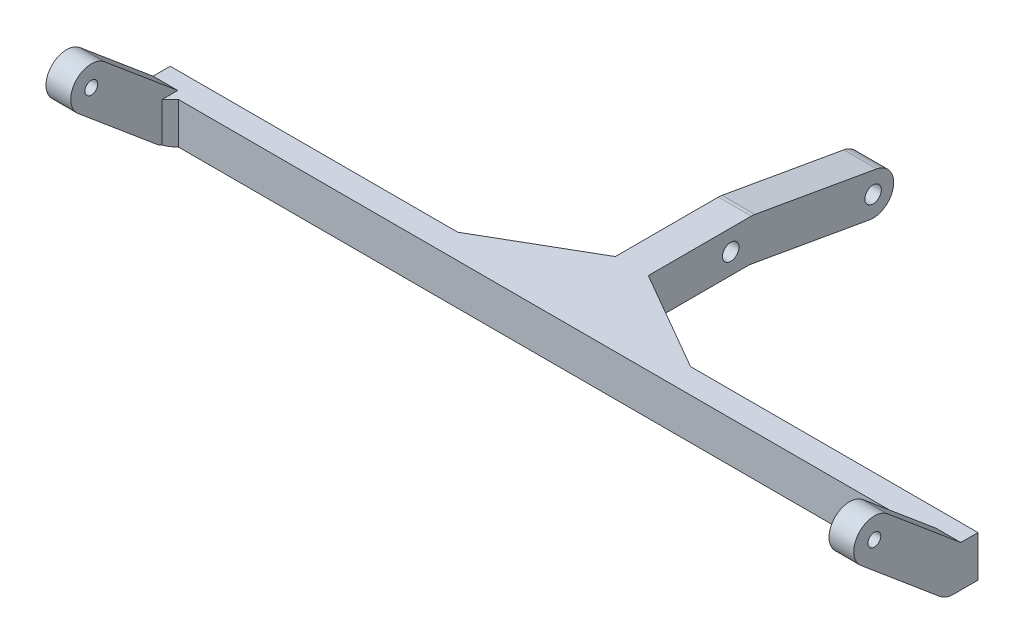
ISO-10303-21;
HEADER;
FILE_DESCRIPTION(('STEP AP214'),'2;1');
FILE_NAME('part.step','',(''),(''),'','','');
FILE_SCHEMA(('AUTOMOTIVE_DESIGN { 1 0 10303 214 1 1 1 1 }'));
ENDSEC;
DATA;
#1=APPLICATION_CONTEXT('core data for automotive mechanical design processes');
#2=APPLICATION_PROTOCOL_DEFINITION('international standard','automotive_design',2000,#1);
#3=PRODUCT_CONTEXT('',#1,'mechanical');
#4=PRODUCT('Part','Part','',(#3));
#5=PRODUCT_RELATED_PRODUCT_CATEGORY('part','',(#4));
#6=PRODUCT_DEFINITION_FORMATION('','',#4);
#7=PRODUCT_DEFINITION_CONTEXT('part definition',#1,'design');
#8=PRODUCT_DEFINITION('design','',#6,#7);
#9=PRODUCT_DEFINITION_SHAPE('','',#8);
#10=(LENGTH_UNIT() NAMED_UNIT(*) SI_UNIT(.MILLI.,.METRE.));
#11=(NAMED_UNIT(*) PLANE_ANGLE_UNIT() SI_UNIT($,.RADIAN.));
#12=(NAMED_UNIT(*) SI_UNIT($,.STERADIAN.) SOLID_ANGLE_UNIT());
#13=UNCERTAINTY_MEASURE_WITH_UNIT(LENGTH_MEASURE(1.E-05),#10,'distance_accuracy_value','');
#14=(GEOMETRIC_REPRESENTATION_CONTEXT(3) GLOBAL_UNCERTAINTY_ASSIGNED_CONTEXT((#13)) GLOBAL_UNIT_ASSIGNED_CONTEXT((#10,
#11,#12)) REPRESENTATION_CONTEXT('',''));
#15=CARTESIAN_POINT('',(0.,0.,0.));
#16=DIRECTION('',(0.,0.,1.));
#17=DIRECTION('',(1.,0.,0.));
#18=AXIS2_PLACEMENT_3D('',#15,#16,#17);
#19=CARTESIAN_POINT('',(0.,-5.,0.));
#20=DIRECTION('',(0.,-1.,0.));
#21=DIRECTION('',(0.,0.,-1.));
#22=AXIS2_PLACEMENT_3D('',#19,#20,#21);
#23=PLANE('',#22);
#24=DIRECTION('',(0.,0.,1.));
#25=VECTOR('',#24,1.);
#26=CARTESIAN_POINT('',(-98.,-5.,0.));
#27=LINE('',#26,#25);
#28=CARTESIAN_POINT('',(-98.,-5.,-5.99999999999996));
#29=VERTEX_POINT('',#28);
#30=CARTESIAN_POINT('',(-98.,-5.,0.));
#31=VERTEX_POINT('',#30);
#32=EDGE_CURVE('E279',#29,#31,#27,.T.);
#33=ORIENTED_EDGE('',*,*,#32,.F.);
#34=DIRECTION('',(1.,0.,0.));
#35=VECTOR('',#34,1.);
#36=CARTESIAN_POINT('',(-24.7846096908263,-5.,-5.99999999999995));
#37=LINE('',#36,#35);
#38=CARTESIAN_POINT('',(-28.248711305964,-5.,-5.99999999999995));
#39=VERTEX_POINT('',#38);
#40=EDGE_CURVE('E210',#29,#39,#37,.T.);
#41=ORIENTED_EDGE('',*,*,#40,.T.);
#42=DIRECTION('',(-0.866025403784436,0.,0.500000000000004));
#43=VECTOR('',#42,1.);
#44=CARTESIAN_POINT('',(-24.7846096908263,-5.,-7.99999999999998));
#45=LINE('',#44,#43);
#46=CARTESIAN_POINT('',(-3.99999999999998,-5.,-20.));
#47=VERTEX_POINT('',#46);
#48=EDGE_CURVE('E296',#47,#39,#45,.T.);
#49=ORIENTED_EDGE('',*,*,#48,.F.);
#50=DIRECTION('',(0.,0.,1.));
#51=VECTOR('',#50,1.);
#52=CARTESIAN_POINT('',(-3.99999999999998,-5.,-20.));
#53=LINE('',#52,#51);
#54=CARTESIAN_POINT('',(-4.,-5.,-44.5625566823704));
#55=VERTEX_POINT('',#54);
#56=EDGE_CURVE('E293',#55,#47,#53,.T.);
#57=ORIENTED_EDGE('',*,*,#56,.F.);
#58=DIRECTION('',(1.,0.,0.));
#59=VECTOR('',#58,1.);
#60=CARTESIAN_POINT('',(0.,-5.,-44.5625566823704));
#61=LINE('',#60,#59);
#62=CARTESIAN_POINT('',(4.,-5.,-44.5625566823704));
#63=VERTEX_POINT('',#62);
#64=EDGE_CURVE('E184',#55,#63,#61,.T.);
#65=ORIENTED_EDGE('',*,*,#64,.T.);
#66=DIRECTION('',(0.,0.,-1.));
#67=VECTOR('',#66,1.);
#68=CARTESIAN_POINT('',(4.,-5.,-20.));
#69=LINE('',#68,#67);
#70=CARTESIAN_POINT('',(4.,-5.,-20.));
#71=VERTEX_POINT('',#70);
#72=EDGE_CURVE('E290',#71,#63,#69,.T.);
#73=ORIENTED_EDGE('',*,*,#72,.F.);
#74=DIRECTION('',(-0.866025403784436,0.,-0.500000000000004));
#75=VECTOR('',#74,1.);
#76=CARTESIAN_POINT('',(24.7846096908263,-5.,-7.99999999999998));
#77=LINE('',#76,#75);
#78=CARTESIAN_POINT('',(28.248711305964,-5.,-5.99999999999998));
#79=VERTEX_POINT('',#78);
#80=EDGE_CURVE('E288',#79,#71,#77,.T.);
#81=ORIENTED_EDGE('',*,*,#80,.F.);
#82=DIRECTION('',(1.,0.,0.));
#83=VECTOR('',#82,1.);
#84=CARTESIAN_POINT('',(98.,-5.,-6.00000000000001));
#85=LINE('',#84,#83);
#86=CARTESIAN_POINT('',(98.,-5.,-5.99999999999999));
#87=VERTEX_POINT('',#86);
#88=EDGE_CURVE('E148',#79,#87,#85,.T.);
#89=ORIENTED_EDGE('',*,*,#88,.T.);
#90=DIRECTION('',(0.,0.,-1.));
#91=VECTOR('',#90,1.);
#92=CARTESIAN_POINT('',(98.,-5.,0.));
#93=LINE('',#92,#91);
#94=CARTESIAN_POINT('',(98.,-5.,0.));
#95=VERTEX_POINT('',#94);
#96=EDGE_CURVE('E284',#95,#87,#93,.T.);
#97=ORIENTED_EDGE('',*,*,#96,.F.);
#98=DIRECTION('',(1.,0.,0.));
#99=VECTOR('',#98,1.);
#100=CARTESIAN_POINT('',(98.,-5.,0.));
#101=LINE('',#100,#99);
#102=CARTESIAN_POINT('',(90.,-5.,0.));
#103=VERTEX_POINT('',#102);
#104=EDGE_CURVE('E55',#103,#95,#101,.T.);
#105=ORIENTED_EDGE('',*,*,#104,.F.);
#106=CARTESIAN_POINT('',(-90.,-5.,0.));
#107=VERTEX_POINT('',#106);
#108=EDGE_CURVE('E285',#107,#103,#101,.T.);
#109=ORIENTED_EDGE('',*,*,#108,.F.);
#110=EDGE_CURVE('E77',#31,#107,#101,.T.);
#111=ORIENTED_EDGE('',*,*,#110,.F.);
#112=EDGE_LOOP('',(#33,#41,#49,#57,#65,#73,#81,#89,#97,#105,#109,#111));
#113=FACE_BOUND('',#112,.T.);
#114=ADVANCED_FACE('F37',(#113),#23,.T.);
#115=CARTESIAN_POINT('',(-98.,5.,0.));
#116=DIRECTION('',(1.,0.,0.));
#117=DIRECTION('',(0.,0.,-1.));
#118=AXIS2_PLACEMENT_3D('',#115,#116,#117);
#119=PLANE('',#118);
#120=DIRECTION('',(0.,0.,1.));
#121=VECTOR('',#120,1.);
#122=CARTESIAN_POINT('',(-98.,5.,0.));
#123=LINE('',#122,#121);
#124=CARTESIAN_POINT('',(-98.,5.,-5.99999999999996));
#125=VERTEX_POINT('',#124);
#126=CARTESIAN_POINT('',(-98.,5.,-1.819851171331));
#127=VERTEX_POINT('',#126);
#128=EDGE_CURVE('E268',#125,#127,#123,.T.);
#129=ORIENTED_EDGE('',*,*,#128,.F.);
#130=DIRECTION('',(0.,-1.,0.));
#131=VECTOR('',#130,1.);
#132=CARTESIAN_POINT('',(-98.,5.,-5.99999999999996));
#133=LINE('',#132,#131);
#134=EDGE_CURVE('E213',#125,#29,#133,.T.);
#135=ORIENTED_EDGE('',*,*,#134,.T.);
#136=ORIENTED_EDGE('',*,*,#32,.T.);
#137=CARTESIAN_POINT('',(-98.,0.,0.));
#138=DIRECTION('',(1.,0.,0.));
#139=DIRECTION('',(0.,0.,-1.));
#140=AXIS2_PLACEMENT_3D('',#137,#138,#139);
#141=CIRCLE('',#140,5.);
#142=CARTESIAN_POINT('',(-98.,-3.83022221559491,3.21393804843268));
#143=VERTEX_POINT('',#142);
#144=EDGE_CURVE('E403',#143,#31,#141,.T.);
#145=ORIENTED_EDGE('',*,*,#144,.F.);
#146=DIRECTION('',(0.,-0.642787609686535,-0.766044443118982));
#147=VECTOR('',#146,1.);
#148=CARTESIAN_POINT('',(-98.,-1.76434265976225,5.6759574309632));
#149=LINE('',#148,#147);
#150=CARTESIAN_POINT('',(-98.,12.2394680265685,22.3650491264072));
#151=VERTEX_POINT('',#150);
#152=EDGE_CURVE('E405',#151,#143,#149,.T.);
#153=ORIENTED_EDGE('',*,*,#152,.F.);
#154=CARTESIAN_POINT('',(-98.,16.0696902421634,19.1511110779745));
#155=DIRECTION('',(1.,0.,0.));
#156=DIRECTION('',(0.,0.,-1.));
#157=AXIS2_PLACEMENT_3D('',#154,#155,#156);
#158=CIRCLE('',#157,5.);
#159=CARTESIAN_POINT('',(-98.,19.8999124577583,15.9371730295419));
#160=VERTEX_POINT('',#159);
#161=EDGE_CURVE('E398',#160,#151,#158,.T.);
#162=ORIENTED_EDGE('',*,*,#161,.F.);
#163=DIRECTION('',(0.,0.642787609686535,0.766044443118982));
#164=VECTOR('',#163,1.);
#165=CARTESIAN_POINT('',(-98.,5.89610177142756,-0.751918665902149));
#166=LINE('',#165,#164);
#167=EDGE_CURVE('E344',#127,#160,#166,.T.);
#168=ORIENTED_EDGE('',*,*,#167,.F.);
#169=EDGE_LOOP('',(#129,#135,#136,#145,#153,#162,#168));
#170=FACE_BOUND('',#169,.T.);
#171=CARTESIAN_POINT('',(-98.,16.0696902421634,19.1511110779745));
#172=DIRECTION('',(1.,0.,0.));
#173=DIRECTION('',(0.,0.,-1.));
#174=AXIS2_PLACEMENT_3D('',#171,#172,#173);
#175=CIRCLE('',#174,1.56363376584898);
#176=CARTESIAN_POINT('',(-98.,16.0696902421634,17.5874773121256));
#177=VERTEX_POINT('',#176);
#178=EDGE_CURVE('E419',#177,#177,#175,.T.);
#179=ORIENTED_EDGE('',*,*,#178,.T.);
#180=EDGE_LOOP('',(#179));
#181=FACE_BOUND('',#180,.T.);
#182=ADVANCED_FACE('F335',(#170,#181),#119,.F.);
#183=CARTESIAN_POINT('',(98.,5.,0.));
#184=DIRECTION('',(0.,0.,-1.));
#185=DIRECTION('',(-1.,0.,0.));
#186=AXIS2_PLACEMENT_3D('',#183,#184,#185);
#187=PLANE('',#186);
#188=DIRECTION('',(1.,0.,0.));
#189=VECTOR('',#188,1.);
#190=CARTESIAN_POINT('',(98.,5.,0.));
#191=LINE('',#190,#189);
#192=CARTESIAN_POINT('',(-90.,5.,0.));
#193=VERTEX_POINT('',#192);
#194=CARTESIAN_POINT('',(90.,5.,0.));
#195=VERTEX_POINT('',#194);
#196=EDGE_CURVE('E263',#193,#195,#191,.T.);
#197=ORIENTED_EDGE('',*,*,#196,.F.);
#198=DIRECTION('',(0.,-1.,0.));
#199=VECTOR('',#198,1.);
#200=CARTESIAN_POINT('',(-90.,5.,0.));
#201=LINE('',#200,#199);
#202=EDGE_CURVE('E194',#193,#107,#201,.T.);
#203=ORIENTED_EDGE('',*,*,#202,.T.);
#204=ORIENTED_EDGE('',*,*,#108,.T.);
#205=DIRECTION('',(0.,1.,0.));
#206=VECTOR('',#205,1.);
#207=CARTESIAN_POINT('',(90.,5.,0.));
#208=LINE('',#207,#206);
#209=EDGE_CURVE('E187',#103,#195,#208,.T.);
#210=ORIENTED_EDGE('',*,*,#209,.T.);
#211=EDGE_LOOP('',(#197,#203,#204,#210));
#212=FACE_BOUND('',#211,.T.);
#213=ADVANCED_FACE('F485',(#212),#187,.F.);
#214=CARTESIAN_POINT('',(98.,5.,0.));
#215=DIRECTION('',(-1.,0.,0.));
#216=DIRECTION('',(0.,0.,1.));
#217=AXIS2_PLACEMENT_3D('',#214,#215,#216);
#218=PLANE('',#217);
#219=ORIENTED_EDGE('',*,*,#96,.T.);
#220=DIRECTION('',(0.,1.,0.));
#221=VECTOR('',#220,1.);
#222=CARTESIAN_POINT('',(98.,5.,-5.99999999999999));
#223=LINE('',#222,#221);
#224=CARTESIAN_POINT('',(98.,5.,-6.00000000000001));
#225=VERTEX_POINT('',#224);
#226=EDGE_CURVE('E158',#87,#225,#223,.T.);
#227=ORIENTED_EDGE('',*,*,#226,.T.);
#228=DIRECTION('',(0.,0.,-1.));
#229=VECTOR('',#228,1.);
#230=CARTESIAN_POINT('',(98.,5.,0.));
#231=LINE('',#230,#229);
#232=CARTESIAN_POINT('',(98.,5.,-1.819851171331));
#233=VERTEX_POINT('',#232);
#234=EDGE_CURVE('E256',#233,#225,#231,.T.);
#235=ORIENTED_EDGE('',*,*,#234,.F.);
#236=DIRECTION('',(0.,0.642787609686535,0.766044443118982));
#237=VECTOR('',#236,1.);
#238=CARTESIAN_POINT('',(98.,5.89610177142756,-0.751918665902149));
#239=LINE('',#238,#237);
#240=CARTESIAN_POINT('',(97.9999999999999,19.8999124577583,15.9371730295419));
#241=VERTEX_POINT('',#240);
#242=EDGE_CURVE('E365',#233,#241,#239,.T.);
#243=ORIENTED_EDGE('',*,*,#242,.T.);
#244=CARTESIAN_POINT('',(97.9999999999999,16.0696902421634,19.1511110779745));
#245=DIRECTION('',(-1.,0.,0.));
#246=DIRECTION('',(0.,0.,1.));
#247=AXIS2_PLACEMENT_3D('',#244,#245,#246);
#248=CIRCLE('',#247,5.);
#249=CARTESIAN_POINT('',(97.9999999999999,12.2394680265685,22.3650491264072));
#250=VERTEX_POINT('',#249);
#251=EDGE_CURVE('E367',#250,#241,#248,.T.);
#252=ORIENTED_EDGE('',*,*,#251,.F.);
#253=DIRECTION('',(0.,-0.642787609686535,-0.766044443118982));
#254=VECTOR('',#253,1.);
#255=CARTESIAN_POINT('',(98.,-1.76434265976225,5.6759574309632));
#256=LINE('',#255,#254);
#257=CARTESIAN_POINT('',(98.,-3.83022221559491,3.21393804843267));
#258=VERTEX_POINT('',#257);
#259=EDGE_CURVE('E358',#250,#258,#256,.T.);
#260=ORIENTED_EDGE('',*,*,#259,.T.);
#261=CARTESIAN_POINT('',(98.,0.,0.));
#262=DIRECTION('',(-1.,0.,0.));
#263=DIRECTION('',(0.,0.,1.));
#264=AXIS2_PLACEMENT_3D('',#261,#262,#263);
#265=CIRCLE('',#264,5.);
#266=EDGE_CURVE('E362',#95,#258,#265,.T.);
#267=ORIENTED_EDGE('',*,*,#266,.F.);
#268=EDGE_LOOP('',(#219,#227,#235,#243,#252,#260,#267));
#269=FACE_BOUND('',#268,.T.);
#270=CARTESIAN_POINT('',(97.9999999999999,16.0696902421634,19.1511110779745));
#271=DIRECTION('',(-1.,0.,0.));
#272=DIRECTION('',(0.,0.,1.));
#273=AXIS2_PLACEMENT_3D('',#270,#271,#272);
#274=CIRCLE('',#273,1.56363376584898);
#275=CARTESIAN_POINT('',(97.9999999999999,16.0696902421634,20.7147448438235));
#276=VERTEX_POINT('',#275);
#277=EDGE_CURVE('E381',#276,#276,#274,.T.);
#278=ORIENTED_EDGE('',*,*,#277,.T.);
#279=EDGE_LOOP('',(#278));
#280=FACE_BOUND('',#279,.T.);
#281=ADVANCED_FACE('F504',(#269,#280),#218,.F.);
#282=CARTESIAN_POINT('',(98.,5.,-8.00000000000001));
#283=DIRECTION('',(0.,0.,1.));
#284=DIRECTION('',(1.,0.,0.));
#285=AXIS2_PLACEMENT_3D('',#282,#283,#284);
#286=PLANE('',#285);
#287=DIRECTION('',(0.,-1.,0.));
#288=VECTOR('',#287,1.);
#289=CARTESIAN_POINT('',(96.,5.,-8.00000000000001));
#290=LINE('',#289,#288);
#291=CARTESIAN_POINT('',(96.,3.00000000000003,-8.00000000000001));
#292=VERTEX_POINT('',#291);
#293=CARTESIAN_POINT('',(96.,-3.00000000000003,-8.00000000000001));
#294=VERTEX_POINT('',#293);
#295=EDGE_CURVE('E64',#292,#294,#290,.T.);
#296=ORIENTED_EDGE('',*,*,#295,.T.);
#297=DIRECTION('',(-1.,0.,0.));
#298=VECTOR('',#297,1.);
#299=CARTESIAN_POINT('',(24.7846096908263,-3.00000000000003,-7.99999999999998));
#300=LINE('',#299,#298);
#301=CARTESIAN_POINT('',(24.7846096908263,-3.00000000000003,-7.99999999999998));
#302=VERTEX_POINT('',#301);
#303=EDGE_CURVE('E147',#294,#302,#300,.T.);
#304=ORIENTED_EDGE('',*,*,#303,.T.);
#305=DIRECTION('',(0.,-1.,0.));
#306=VECTOR('',#305,1.);
#307=CARTESIAN_POINT('',(24.7846096908263,5.,-7.99999999999998));
#308=LINE('',#307,#306);
#309=CARTESIAN_POINT('',(24.7846096908263,3.00000000000003,-7.99999999999998));
#310=VERTEX_POINT('',#309);
#311=EDGE_CURVE('E156',#310,#302,#308,.T.);
#312=ORIENTED_EDGE('',*,*,#311,.F.);
#313=DIRECTION('',(1.,0.,0.));
#314=VECTOR('',#313,1.);
#315=CARTESIAN_POINT('',(98.,3.00000000000003,-8.00000000000001));
#316=LINE('',#315,#314);
#317=EDGE_CURVE('E220',#310,#292,#316,.T.);
#318=ORIENTED_EDGE('',*,*,#317,.T.);
#319=EDGE_LOOP('',(#296,#304,#312,#318));
#320=FACE_BOUND('',#319,.T.);
#321=ADVANCED_FACE('F155',(#320),#286,.F.);
#322=CARTESIAN_POINT('',(24.7846096908263,5.,-7.99999999999998));
#323=DIRECTION('',(-0.500000000000004,0.,0.866025403784436));
#324=DIRECTION('',(0.866025403784436,0.,0.500000000000004));
#325=AXIS2_PLACEMENT_3D('',#322,#323,#324);
#326=PLANE('',#325);
#327=ORIENTED_EDGE('',*,*,#80,.T.);
#328=DIRECTION('',(0.,-1.,0.));
#329=VECTOR('',#328,1.);
#330=CARTESIAN_POINT('',(4.,5.,-20.));
#331=LINE('',#330,#329);
#332=CARTESIAN_POINT('',(4.,5.,-20.));
#333=VERTEX_POINT('',#332);
#334=EDGE_CURVE('E163',#333,#71,#331,.T.);
#335=ORIENTED_EDGE('',*,*,#334,.F.);
#336=DIRECTION('',(-0.866025403784436,0.,-0.500000000000004));
#337=VECTOR('',#336,1.);
#338=CARTESIAN_POINT('',(24.7846096908263,5.,-7.99999999999998));
#339=LINE('',#338,#337);
#340=CARTESIAN_POINT('',(28.248711305964,5.,-5.99999999999998));
#341=VERTEX_POINT('',#340);
#342=EDGE_CURVE('E253',#341,#333,#339,.T.);
#343=ORIENTED_EDGE('',*,*,#342,.F.);
#344=DIRECTION('',(0.774596669241482,0.447213595499956,0.447213595499962));
#345=VECTOR('',#344,1.);
#346=CARTESIAN_POINT('',(25.4774300138538,3.40000000000002,-7.59999999999999));
#347=LINE('',#346,#345);
#348=EDGE_CURVE('E11',#341,#310,#347,.F.);
#349=ORIENTED_EDGE('',*,*,#348,.T.);
#350=ORIENTED_EDGE('',*,*,#311,.T.);
#351=DIRECTION('',(0.774596669241482,-0.447213595499956,0.447213595499962));
#352=VECTOR('',#351,1.);
#353=CARTESIAN_POINT('',(22.0133283987161,-1.40000000000003,-9.6));
#354=LINE('',#353,#352);
#355=EDGE_CURVE('E47',#302,#79,#354,.T.);
#356=ORIENTED_EDGE('',*,*,#355,.T.);
#357=EDGE_LOOP('',(#327,#335,#343,#349,#350,#356));
#358=FACE_BOUND('',#357,.T.);
#359=ADVANCED_FACE('F160',(#358),#326,.F.);
#360=CARTESIAN_POINT('',(4.,5.,-20.));
#361=DIRECTION('',(-1.,0.,0.));
#362=DIRECTION('',(0.,0.,1.));
#363=AXIS2_PLACEMENT_3D('',#360,#361,#362);
#364=PLANE('',#363);
#365=CARTESIAN_POINT('',(4.,0.,-40.));
#366=DIRECTION('',(-1.,0.,0.));
#367=DIRECTION('',(0.,0.,1.));
#368=AXIS2_PLACEMENT_3D('',#365,#366,#367);
#369=CIRCLE('',#368,2.);
#370=CARTESIAN_POINT('',(4.,0.,-38.));
#371=VERTEX_POINT('',#370);
#372=EDGE_CURVE('E191',#371,#371,#369,.T.);
#373=ORIENTED_EDGE('',*,*,#372,.T.);
#374=EDGE_LOOP('',(#373));
#375=FACE_BOUND('',#374,.T.);
#376=CARTESIAN_POINT('',(4.,0.,-45.));
#377=DIRECTION('',(-1.,0.,0.));
#378=DIRECTION('',(0.,0.,1.));
#379=AXIS2_PLACEMENT_3D('',#376,#377,#378);
#380=CIRCLE('',#379,5.);
#381=CARTESIAN_POINT('',(4.,4.92403876506104,-45.8682408883347));
#382=VERTEX_POINT('',#381);
#383=CARTESIAN_POINT('',(4.,5.,-45.));
#384=VERTEX_POINT('',#383);
#385=EDGE_CURVE('E166',#382,#384,#380,.F.);
#386=ORIENTED_EDGE('',*,*,#385,.T.);
#387=DIRECTION('',(0.,0.,-1.));
#388=VECTOR('',#387,1.);
#389=CARTESIAN_POINT('',(4.,5.,-20.));
#390=LINE('',#389,#388);
#391=EDGE_CURVE('E265',#333,#384,#390,.T.);
#392=ORIENTED_EDGE('',*,*,#391,.F.);
#393=ORIENTED_EDGE('',*,*,#334,.T.);
#394=ORIENTED_EDGE('',*,*,#72,.T.);
#395=DIRECTION('',(0.,-0.173648177666931,-0.984807753012208));
#396=VECTOR('',#395,1.);
#397=CARTESIAN_POINT('',(4.,-4.92403876506104,-44.1317591116654));
#398=LINE('',#397,#396);
#399=CARTESIAN_POINT('',(4.,-10.133484095069,-73.6759917020316));
#400=VERTEX_POINT('',#399);
#401=EDGE_CURVE('E437',#63,#400,#398,.T.);
#402=ORIENTED_EDGE('',*,*,#401,.T.);
#403=CARTESIAN_POINT('',(4.,-5.20944533000792,-74.5442325903662));
#404=DIRECTION('',(1.,0.,0.));
#405=DIRECTION('',(0.,0.,-1.));
#406=AXIS2_PLACEMENT_3D('',#403,#404,#405);
#407=CIRCLE('',#406,5.);
#408=CARTESIAN_POINT('',(4.,-0.285406564946883,-75.4124734787009));
#409=VERTEX_POINT('',#408);
#410=EDGE_CURVE('E447',#400,#409,#407,.T.);
#411=ORIENTED_EDGE('',*,*,#410,.T.);
#412=DIRECTION('',(0.,0.173648177666931,0.984807753012208));
#413=VECTOR('',#412,1.);
#414=CARTESIAN_POINT('',(4.,4.92403876506104,-45.8682408883347));
#415=LINE('',#414,#413);
#416=EDGE_CURVE('E433',#409,#382,#415,.T.);
#417=ORIENTED_EDGE('',*,*,#416,.T.);
#418=EDGE_LOOP('',(#386,#392,#393,#394,#402,#411,#417));
#419=FACE_BOUND('',#418,.T.);
#420=CARTESIAN_POINT('',(4.,-5.20944533000792,-74.5442325903662));
#421=DIRECTION('',(1.,0.,0.));
#422=DIRECTION('',(0.,0.,-1.));
#423=AXIS2_PLACEMENT_3D('',#420,#421,#422);
#424=CIRCLE('',#423,2.);
#425=CARTESIAN_POINT('',(4.,-5.20944533000792,-76.5442325903662));
#426=VERTEX_POINT('',#425);
#427=EDGE_CURVE('E444',#426,#426,#424,.T.);
#428=ORIENTED_EDGE('',*,*,#427,.F.);
#429=EDGE_LOOP('',(#428));
#430=FACE_BOUND('',#429,.T.);
#431=ADVANCED_FACE('F460',(#375,#419,#430),#364,.F.);
#432=CARTESIAN_POINT('',(-3.99999999999998,5.,-20.));
#433=DIRECTION('',(1.,0.,0.));
#434=DIRECTION('',(0.,0.,-1.));
#435=AXIS2_PLACEMENT_3D('',#432,#433,#434);
#436=PLANE('',#435);
#437=CARTESIAN_POINT('',(-3.99999999999998,0.,-40.));
#438=DIRECTION('',(1.,0.,0.));
#439=DIRECTION('',(0.,0.,-1.));
#440=AXIS2_PLACEMENT_3D('',#437,#438,#439);
#441=CIRCLE('',#440,2.);
#442=CARTESIAN_POINT('',(-3.99999999999998,0.,-42.));
#443=VERTEX_POINT('',#442);
#444=EDGE_CURVE('E188',#443,#443,#441,.T.);
#445=ORIENTED_EDGE('',*,*,#444,.T.);
#446=EDGE_LOOP('',(#445));
#447=FACE_BOUND('',#446,.T.);
#448=DIRECTION('',(0.,0.,1.));
#449=VECTOR('',#448,1.);
#450=CARTESIAN_POINT('',(-3.99999999999998,5.,-20.));
#451=LINE('',#450,#449);
#452=CARTESIAN_POINT('',(-3.99999999999999,5.,-45.));
#453=VERTEX_POINT('',#452);
#454=CARTESIAN_POINT('',(-3.99999999999998,5.,-20.));
#455=VERTEX_POINT('',#454);
#456=EDGE_CURVE('E273',#453,#455,#451,.T.);
#457=ORIENTED_EDGE('',*,*,#456,.F.);
#458=CARTESIAN_POINT('',(-3.99999999999999,0.,-45.));
#459=DIRECTION('',(1.,0.,0.));
#460=DIRECTION('',(0.,0.,-1.));
#461=AXIS2_PLACEMENT_3D('',#458,#459,#460);
#462=CIRCLE('',#461,5.);
#463=CARTESIAN_POINT('',(-4.,4.92403876506104,-45.8682408883347));
#464=VERTEX_POINT('',#463);
#465=EDGE_CURVE('E162',#453,#464,#462,.F.);
#466=ORIENTED_EDGE('',*,*,#465,.T.);
#467=DIRECTION('',(0.,0.173648177666931,0.984807753012208));
#468=VECTOR('',#467,1.);
#469=CARTESIAN_POINT('',(-4.,4.92403876506104,-45.8682408883347));
#470=LINE('',#469,#468);
#471=CARTESIAN_POINT('',(-4.,-0.285406564946883,-75.4124734787009));
#472=VERTEX_POINT('',#471);
#473=EDGE_CURVE('E434',#472,#464,#470,.T.);
#474=ORIENTED_EDGE('',*,*,#473,.F.);
#475=CARTESIAN_POINT('',(-4.,-5.20944533000792,-74.5442325903662));
#476=DIRECTION('',(1.,0.,0.));
#477=DIRECTION('',(0.,0.,-1.));
#478=AXIS2_PLACEMENT_3D('',#475,#476,#477);
#479=CIRCLE('',#478,5.);
#480=CARTESIAN_POINT('',(-4.,-10.133484095069,-73.6759917020316));
#481=VERTEX_POINT('',#480);
#482=EDGE_CURVE('E438',#481,#472,#479,.T.);
#483=ORIENTED_EDGE('',*,*,#482,.F.);
#484=DIRECTION('',(0.,-0.173648177666931,-0.984807753012208));
#485=VECTOR('',#484,1.);
#486=CARTESIAN_POINT('',(-4.,-4.92403876506104,-44.1317591116654));
#487=LINE('',#486,#485);
#488=EDGE_CURVE('E441',#55,#481,#487,.T.);
#489=ORIENTED_EDGE('',*,*,#488,.F.);
#490=ORIENTED_EDGE('',*,*,#56,.T.);
#491=DIRECTION('',(0.,-1.,0.));
#492=VECTOR('',#491,1.);
#493=CARTESIAN_POINT('',(-3.99999999999998,5.,-20.));
#494=LINE('',#493,#492);
#495=EDGE_CURVE('E169',#455,#47,#494,.T.);
#496=ORIENTED_EDGE('',*,*,#495,.F.);
#497=EDGE_LOOP('',(#457,#466,#474,#483,#489,#490,#496));
#498=FACE_BOUND('',#497,.T.);
#499=CARTESIAN_POINT('',(-4.,-5.20944533000792,-74.5442325903662));
#500=DIRECTION('',(1.,0.,0.));
#501=DIRECTION('',(0.,0.,-1.));
#502=AXIS2_PLACEMENT_3D('',#499,#500,#501);
#503=CIRCLE('',#502,2.);
#504=CARTESIAN_POINT('',(-4.,-5.20944533000792,-76.5442325903662));
#505=VERTEX_POINT('',#504);
#506=EDGE_CURVE('E452',#505,#505,#503,.T.);
#507=ORIENTED_EDGE('',*,*,#506,.T.);
#508=EDGE_LOOP('',(#507));
#509=FACE_BOUND('',#508,.T.);
#510=ADVANCED_FACE('F494',(#447,#498,#509),#436,.F.);
#511=CARTESIAN_POINT('',(-24.7846096908263,5.,-7.99999999999998));
#512=DIRECTION('',(0.500000000000004,0.,0.866025403784436));
#513=DIRECTION('',(0.866025403784436,0.,-0.500000000000004));
#514=AXIS2_PLACEMENT_3D('',#511,#512,#513);
#515=PLANE('',#514);
#516=ORIENTED_EDGE('',*,*,#48,.T.);
#517=DIRECTION('',(0.774596669241482,0.447213595499956,-0.447213595499962));
#518=VECTOR('',#517,1.);
#519=CARTESIAN_POINT('',(-22.0133283987161,-1.40000000000001,-9.59999999999998));
#520=LINE('',#519,#518);
#521=CARTESIAN_POINT('',(-24.7846096908263,-3.,-7.99999999999998));
#522=VERTEX_POINT('',#521);
#523=EDGE_CURVE('E232',#39,#522,#520,.T.);
#524=ORIENTED_EDGE('',*,*,#523,.T.);
#525=DIRECTION('',(0.,-1.,0.));
#526=VECTOR('',#525,1.);
#527=CARTESIAN_POINT('',(-24.7846096908263,5.,-7.99999999999998));
#528=LINE('',#527,#526);
#529=CARTESIAN_POINT('',(-24.7846096908263,3.,-7.99999999999998));
#530=VERTEX_POINT('',#529);
#531=EDGE_CURVE('E278',#530,#522,#528,.T.);
#532=ORIENTED_EDGE('',*,*,#531,.F.);
#533=DIRECTION('',(0.774596669241482,-0.447213595499956,-0.447213595499962));
#534=VECTOR('',#533,1.);
#535=CARTESIAN_POINT('',(-25.4774300138538,3.4,-7.59999999999997));
#536=LINE('',#535,#534);
#537=CARTESIAN_POINT('',(-28.248711305964,5.,-5.99999999999995));
#538=VERTEX_POINT('',#537);
#539=EDGE_CURVE('E152',#530,#538,#536,.F.);
#540=ORIENTED_EDGE('',*,*,#539,.T.);
#541=DIRECTION('',(-0.866025403784436,0.,0.500000000000004));
#542=VECTOR('',#541,1.);
#543=CARTESIAN_POINT('',(-24.7846096908263,5.,-7.99999999999998));
#544=LINE('',#543,#542);
#545=EDGE_CURVE('E276',#455,#538,#544,.T.);
#546=ORIENTED_EDGE('',*,*,#545,.F.);
#547=ORIENTED_EDGE('',*,*,#495,.T.);
#548=EDGE_LOOP('',(#516,#524,#532,#540,#546,#547));
#549=FACE_BOUND('',#548,.T.);
#550=ADVANCED_FACE('F305',(#549),#515,.F.);
#551=CARTESIAN_POINT('',(-98.,5.,-7.99999999999999));
#552=DIRECTION('',(0.,0.,1.));
#553=DIRECTION('',(1.,0.,0.));
#554=AXIS2_PLACEMENT_3D('',#551,#552,#553);
#555=PLANE('',#554);
#556=ORIENTED_EDGE('',*,*,#531,.T.);
#557=DIRECTION('',(-1.,0.,0.));
#558=VECTOR('',#557,1.);
#559=CARTESIAN_POINT('',(-98.,-3.,-7.99999999999999));
#560=LINE('',#559,#558);
#561=CARTESIAN_POINT('',(-96.,-3.,-7.99999999999999));
#562=VERTEX_POINT('',#561);
#563=EDGE_CURVE('E206',#522,#562,#560,.T.);
#564=ORIENTED_EDGE('',*,*,#563,.T.);
#565=DIRECTION('',(0.,1.,0.));
#566=VECTOR('',#565,1.);
#567=CARTESIAN_POINT('',(-96.,5.,-7.99999999999999));
#568=LINE('',#567,#566);
#569=CARTESIAN_POINT('',(-96.,3.,-7.99999999999999));
#570=VERTEX_POINT('',#569);
#571=EDGE_CURVE('E204',#562,#570,#568,.T.);
#572=ORIENTED_EDGE('',*,*,#571,.T.);
#573=DIRECTION('',(1.,0.,0.));
#574=VECTOR('',#573,1.);
#575=CARTESIAN_POINT('',(-98.,3.,-7.99999999999999));
#576=LINE('',#575,#574);
#577=EDGE_CURVE('E202',#570,#530,#576,.T.);
#578=ORIENTED_EDGE('',*,*,#577,.T.);
#579=EDGE_LOOP('',(#556,#564,#572,#578));
#580=FACE_BOUND('',#579,.T.);
#581=ADVANCED_FACE('F323',(#580),#555,.F.);
#582=CARTESIAN_POINT('',(0.,5.,0.));
#583=DIRECTION('',(0.,-1.,0.));
#584=DIRECTION('',(0.,0.,-1.));
#585=AXIS2_PLACEMENT_3D('',#582,#583,#584);
#586=PLANE('',#585);
#587=ORIENTED_EDGE('',*,*,#545,.T.);
#588=DIRECTION('',(-1.,0.,0.));
#589=VECTOR('',#588,1.);
#590=CARTESIAN_POINT('',(0.,5.,-5.99999999999994));
#591=LINE('',#590,#589);
#592=EDGE_CURVE('E218',#538,#125,#591,.T.);
#593=ORIENTED_EDGE('',*,*,#592,.T.);
#594=ORIENTED_EDGE('',*,*,#128,.T.);
#595=DIRECTION('',(-1.,0.,0.));
#596=VECTOR('',#595,1.);
#597=CARTESIAN_POINT('',(0.,5.,-1.819851171331));
#598=LINE('',#597,#596);
#599=CARTESIAN_POINT('',(-92.,5.,-1.819851171331));
#600=VERTEX_POINT('',#599);
#601=EDGE_CURVE('E181',#600,#127,#598,.T.);
#602=ORIENTED_EDGE('',*,*,#601,.F.);
#603=DIRECTION('',(0.,0.,1.));
#604=VECTOR('',#603,1.);
#605=CARTESIAN_POINT('',(-92.,5.,0.));
#606=LINE('',#605,#604);
#607=CARTESIAN_POINT('',(-92.,5.,2.00000000000002));
#608=VERTEX_POINT('',#607);
#609=EDGE_CURVE('E384',#600,#608,#606,.T.);
#610=ORIENTED_EDGE('',*,*,#609,.T.);
#611=DIRECTION('',(0.707106781186543,0.,-0.707106781186552));
#612=VECTOR('',#611,1.);
#613=CARTESIAN_POINT('',(-45.0000000000006,5.,-45.));
#614=LINE('',#613,#612);
#615=EDGE_CURVE('E226',#608,#193,#614,.T.);
#616=ORIENTED_EDGE('',*,*,#615,.T.);
#617=ORIENTED_EDGE('',*,*,#196,.T.);
#618=DIRECTION('',(0.707106781186543,0.,0.707106781186552));
#619=VECTOR('',#618,1.);
#620=CARTESIAN_POINT('',(45.0000000000006,5.,-45.));
#621=LINE('',#620,#619);
#622=CARTESIAN_POINT('',(92.,5.,2.00000000000002));
#623=VERTEX_POINT('',#622);
#624=EDGE_CURVE('E88',#195,#623,#621,.T.);
#625=ORIENTED_EDGE('',*,*,#624,.T.);
#626=DIRECTION('',(0.,0.,-1.));
#627=VECTOR('',#626,1.);
#628=CARTESIAN_POINT('',(92.,5.,3.19189119579731E-13));
#629=LINE('',#628,#627);
#630=CARTESIAN_POINT('',(91.9999999999999,5.,-1.819851171331));
#631=VERTEX_POINT('',#630);
#632=EDGE_CURVE('E282',#623,#631,#629,.T.);
#633=ORIENTED_EDGE('',*,*,#632,.T.);
#634=DIRECTION('',(1.,0.,0.));
#635=VECTOR('',#634,1.);
#636=CARTESIAN_POINT('',(0.,5.,-1.819851171331));
#637=LINE('',#636,#635);
#638=EDGE_CURVE('E178',#631,#233,#637,.T.);
#639=ORIENTED_EDGE('',*,*,#638,.T.);
#640=ORIENTED_EDGE('',*,*,#234,.T.);
#641=DIRECTION('',(-1.,0.,0.));
#642=VECTOR('',#641,1.);
#643=CARTESIAN_POINT('',(0.,5.,-5.99999999999997));
#644=LINE('',#643,#642);
#645=EDGE_CURVE('E215',#225,#341,#644,.T.);
#646=ORIENTED_EDGE('',*,*,#645,.T.);
#647=ORIENTED_EDGE('',*,*,#342,.T.);
#648=ORIENTED_EDGE('',*,*,#391,.T.);
#649=DIRECTION('',(-1.,0.,0.));
#650=VECTOR('',#649,1.);
#651=CARTESIAN_POINT('',(0.,5.,-45.));
#652=LINE('',#651,#650);
#653=EDGE_CURVE('E175',#384,#453,#652,.T.);
#654=ORIENTED_EDGE('',*,*,#653,.T.);
#655=ORIENTED_EDGE('',*,*,#456,.T.);
#656=EDGE_LOOP('',(#587,#593,#594,#602,#610,#616,#617,#625,#633,#639,#640,#646,#647,#648,#654,#655));
#657=FACE_BOUND('',#656,.T.);
#658=ADVANCED_FACE('F250',(#657),#586,.F.);
#659=CARTESIAN_POINT('',(0.,0.,-45.));
#660=DIRECTION('',(-1.,0.,0.));
#661=DIRECTION('',(0.,0.,1.));
#662=AXIS2_PLACEMENT_3D('',#659,#660,#661);
#663=CYLINDRICAL_SURFACE('',#662,5.);
#664=DIRECTION('',(-1.,0.,0.));
#665=VECTOR('',#664,1.);
#666=CARTESIAN_POINT('',(4.,4.92403876506104,-45.8682408883347));
#667=LINE('',#666,#665);
#668=EDGE_CURVE('E430',#382,#464,#667,.T.);
#669=ORIENTED_EDGE('',*,*,#668,.T.);
#670=ORIENTED_EDGE('',*,*,#465,.F.);
#671=ORIENTED_EDGE('',*,*,#653,.F.);
#672=ORIENTED_EDGE('',*,*,#385,.F.);
#673=EDGE_LOOP('',(#669,#670,#671,#672));
#674=FACE_BOUND('',#673,.T.);
#675=ADVANCED_FACE('F510',(#674),#663,.T.);
#676=CARTESIAN_POINT('',(92.,5.89610177142756,-0.751918665902149));
#677=DIRECTION('',(0.,0.766044443118982,-0.642787609686535));
#678=DIRECTION('',(0.,0.642787609686535,0.766044443118982));
#679=AXIS2_PLACEMENT_3D('',#676,#677,#678);
#680=PLANE('',#679);
#681=ORIENTED_EDGE('',*,*,#638,.F.);
#682=DIRECTION('',(0.,0.642787609686535,0.766044443118982));
#683=VECTOR('',#682,1.);
#684=CARTESIAN_POINT('',(92.,5.89610177142756,-0.751918665902149));
#685=LINE('',#684,#683);
#686=CARTESIAN_POINT('',(91.9999999999999,19.8999124577583,15.9371730295419));
#687=VERTEX_POINT('',#686);
#688=EDGE_CURVE('E376',#631,#687,#685,.T.);
#689=ORIENTED_EDGE('',*,*,#688,.T.);
#690=DIRECTION('',(1.,0.,0.));
#691=VECTOR('',#690,1.);
#692=CARTESIAN_POINT('',(91.9999999999999,19.8999124577583,15.9371730295419));
#693=LINE('',#692,#691);
#694=EDGE_CURVE('E348',#687,#241,#693,.T.);
#695=ORIENTED_EDGE('',*,*,#694,.T.);
#696=ORIENTED_EDGE('',*,*,#242,.F.);
#697=EDGE_LOOP('',(#681,#689,#695,#696));
#698=FACE_BOUND('',#697,.T.);
#699=ADVANCED_FACE('F512',(#698),#680,.T.);
#700=CARTESIAN_POINT('',(91.9999999999999,16.0696902421634,19.1511110779745));
#701=DIRECTION('',(-1.,0.,0.));
#702=DIRECTION('',(0.,0.,1.));
#703=AXIS2_PLACEMENT_3D('',#700,#701,#702);
#704=PLANE('',#703);
#705=CARTESIAN_POINT('',(91.9999999999999,16.0696902421634,19.1511110779745));
#706=DIRECTION('',(-1.,0.,0.));
#707=DIRECTION('',(0.,0.,1.));
#708=AXIS2_PLACEMENT_3D('',#705,#706,#707);
#709=CIRCLE('',#708,1.56363376584898);
#710=CARTESIAN_POINT('',(91.9999999999999,16.0696902421634,20.7147448438235));
#711=VERTEX_POINT('',#710);
#712=EDGE_CURVE('E370',#711,#711,#709,.T.);
#713=ORIENTED_EDGE('',*,*,#712,.F.);
#714=EDGE_LOOP('',(#713));
#715=FACE_BOUND('',#714,.T.);
#716=ORIENTED_EDGE('',*,*,#632,.F.);
#717=DIRECTION('',(0.,-1.,0.));
#718=VECTOR('',#717,1.);
#719=CARTESIAN_POINT('',(92.,16.0696902421634,2.00000000000002));
#720=LINE('',#719,#718);
#721=CARTESIAN_POINT('',(92.,-4.58257569495583,2.00000000000002));
#722=VERTEX_POINT('',#721);
#723=EDGE_CURVE('E200',#623,#722,#720,.T.);
#724=ORIENTED_EDGE('',*,*,#723,.T.);
#725=CARTESIAN_POINT('',(92.,0.,0.));
#726=DIRECTION('',(-1.,0.,0.));
#727=DIRECTION('',(0.,0.,1.));
#728=AXIS2_PLACEMENT_3D('',#725,#726,#727);
#729=CIRCLE('',#728,5.);
#730=CARTESIAN_POINT('',(92.,-3.83022221559491,3.21393804843267));
#731=VERTEX_POINT('',#730);
#732=EDGE_CURVE('E373',#722,#731,#729,.T.);
#733=ORIENTED_EDGE('',*,*,#732,.T.);
#734=DIRECTION('',(0.,-0.642787609686535,-0.766044443118982));
#735=VECTOR('',#734,1.);
#736=CARTESIAN_POINT('',(92.,-1.76434265976225,5.6759574309632));
#737=LINE('',#736,#735);
#738=CARTESIAN_POINT('',(91.9999999999999,12.2394680265685,22.3650491264072));
#739=VERTEX_POINT('',#738);
#740=EDGE_CURVE('E357',#739,#731,#737,.T.);
#741=ORIENTED_EDGE('',*,*,#740,.F.);
#742=CARTESIAN_POINT('',(91.9999999999999,16.0696902421634,19.1511110779745));
#743=DIRECTION('',(-1.,0.,0.));
#744=DIRECTION('',(0.,0.,1.));
#745=AXIS2_PLACEMENT_3D('',#742,#743,#744);
#746=CIRCLE('',#745,5.);
#747=EDGE_CURVE('E361',#739,#687,#746,.T.);
#748=ORIENTED_EDGE('',*,*,#747,.T.);
#749=ORIENTED_EDGE('',*,*,#688,.F.);
#750=EDGE_LOOP('',(#716,#724,#733,#741,#748,#749));
#751=FACE_BOUND('',#750,.T.);
#752=ADVANCED_FACE('F608',(#715,#751),#704,.T.);
#753=CARTESIAN_POINT('',(91.9999999999999,16.0696902421634,19.1511110779745));
#754=DIRECTION('',(1.,0.,0.));
#755=DIRECTION('',(0.,0.,-1.));
#756=AXIS2_PLACEMENT_3D('',#753,#754,#755);
#757=CYLINDRICAL_SURFACE('',#756,5.);
#758=ORIENTED_EDGE('',*,*,#251,.T.);
#759=ORIENTED_EDGE('',*,*,#694,.F.);
#760=ORIENTED_EDGE('',*,*,#747,.F.);
#761=DIRECTION('',(1.,0.,0.));
#762=VECTOR('',#761,1.);
#763=CARTESIAN_POINT('',(91.9999999999999,12.2394680265685,22.3650491264072));
#764=LINE('',#763,#762);
#765=EDGE_CURVE('E354',#739,#250,#764,.T.);
#766=ORIENTED_EDGE('',*,*,#765,.T.);
#767=EDGE_LOOP('',(#758,#759,#760,#766));
#768=FACE_BOUND('',#767,.T.);
#769=ADVANCED_FACE('F601',(#768),#757,.T.);
#770=CARTESIAN_POINT('',(92.,0.,0.));
#771=DIRECTION('',(1.,0.,0.));
#772=DIRECTION('',(0.,0.,-1.));
#773=AXIS2_PLACEMENT_3D('',#770,#771,#772);
#774=CYLINDRICAL_SURFACE('',#773,5.);
#775=ORIENTED_EDGE('',*,*,#104,.T.);
#776=ORIENTED_EDGE('',*,*,#266,.T.);
#777=DIRECTION('',(1.,0.,0.));
#778=VECTOR('',#777,1.);
#779=CARTESIAN_POINT('',(92.,-3.83022221559491,3.21393804843267));
#780=LINE('',#779,#778);
#781=EDGE_CURVE('E351',#731,#258,#780,.T.);
#782=ORIENTED_EDGE('',*,*,#781,.F.);
#783=ORIENTED_EDGE('',*,*,#732,.F.);
#784=CARTESIAN_POINT('',(90.,0.,0.));
#785=DIRECTION('',(0.707106781186552,0.,-0.707106781186543));
#786=DIRECTION('',(0.707106781186543,0.,0.707106781186552));
#787=AXIS2_PLACEMENT_3D('',#784,#785,#786);
#788=ELLIPSE('',#787,7.07106781186543,5.);
#789=EDGE_CURVE('E229',#722,#103,#788,.T.);
#790=ORIENTED_EDGE('',*,*,#789,.T.);
#791=EDGE_LOOP('',(#775,#776,#782,#783,#790));
#792=FACE_BOUND('',#791,.T.);
#793=ADVANCED_FACE('F596',(#792),#774,.T.);
#794=CARTESIAN_POINT('',(92.,-1.76434265976225,5.6759574309632));
#795=DIRECTION('',(0.,-0.766044443118982,0.642787609686535));
#796=DIRECTION('',(0.,-0.642787609686535,-0.766044443118982));
#797=AXIS2_PLACEMENT_3D('',#794,#795,#796);
#798=PLANE('',#797);
#799=ORIENTED_EDGE('',*,*,#259,.F.);
#800=ORIENTED_EDGE('',*,*,#765,.F.);
#801=ORIENTED_EDGE('',*,*,#740,.T.);
#802=ORIENTED_EDGE('',*,*,#781,.T.);
#803=EDGE_LOOP('',(#799,#800,#801,#802));
#804=FACE_BOUND('',#803,.T.);
#805=ADVANCED_FACE('F600',(#804),#798,.T.);
#806=CARTESIAN_POINT('',(91.9999999999999,16.0696902421634,19.1511110779745));
#807=DIRECTION('',(1.,0.,0.));
#808=DIRECTION('',(0.,0.,-1.));
#809=AXIS2_PLACEMENT_3D('',#806,#807,#808);
#810=CYLINDRICAL_SURFACE('',#809,1.56363376584898);
#811=ORIENTED_EDGE('',*,*,#712,.T.);
#812=EDGE_LOOP('',(#811));
#813=FACE_BOUND('',#812,.T.);
#814=ORIENTED_EDGE('',*,*,#277,.F.);
#815=EDGE_LOOP('',(#814));
#816=FACE_BOUND('',#815,.T.);
#817=ADVANCED_FACE('F743',(#813,#816),#810,.F.);
#818=CARTESIAN_POINT('',(-92.,5.89610177142756,-0.751918665902149));
#819=DIRECTION('',(0.,-0.766044443118982,0.642787609686535));
#820=DIRECTION('',(0.,-0.642787609686535,-0.766044443118982));
#821=AXIS2_PLACEMENT_3D('',#818,#819,#820);
#822=PLANE('',#821);
#823=DIRECTION('',(0.,0.642787609686535,0.766044443118982));
#824=VECTOR('',#823,1.);
#825=CARTESIAN_POINT('',(-92.,5.89610177142756,-0.751918665902149));
#826=LINE('',#825,#824);
#827=CARTESIAN_POINT('',(-92.,19.8999124577583,15.9371730295419));
#828=VERTEX_POINT('',#827);
#829=EDGE_CURVE('E411',#600,#828,#826,.T.);
#830=ORIENTED_EDGE('',*,*,#829,.F.);
#831=ORIENTED_EDGE('',*,*,#601,.T.);
#832=ORIENTED_EDGE('',*,*,#167,.T.);
#833=DIRECTION('',(-1.,0.,0.));
#834=VECTOR('',#833,1.);
#835=CARTESIAN_POINT('',(-92.,19.8999124577583,15.9371730295419));
#836=LINE('',#835,#834);
#837=EDGE_CURVE('E391',#828,#160,#836,.T.);
#838=ORIENTED_EDGE('',*,*,#837,.F.);
#839=EDGE_LOOP('',(#830,#831,#832,#838));
#840=FACE_BOUND('',#839,.T.);
#841=ADVANCED_FACE('F590',(#840),#822,.F.);
#842=CARTESIAN_POINT('',(-92.,0.,0.));
#843=DIRECTION('',(1.,0.,0.));
#844=DIRECTION('',(0.,0.,-1.));
#845=AXIS2_PLACEMENT_3D('',#842,#843,#844);
#846=PLANE('',#845);
#847=CARTESIAN_POINT('',(-92.,16.0696902421634,19.1511110779745));
#848=DIRECTION('',(1.,0.,0.));
#849=DIRECTION('',(0.,0.,-1.));
#850=AXIS2_PLACEMENT_3D('',#847,#848,#849);
#851=CIRCLE('',#850,1.56363376584898);
#852=CARTESIAN_POINT('',(-92.,16.0696902421634,17.5874773121256));
#853=VERTEX_POINT('',#852);
#854=EDGE_CURVE('E408',#853,#853,#851,.T.);
#855=ORIENTED_EDGE('',*,*,#854,.F.);
#856=EDGE_LOOP('',(#855));
#857=FACE_BOUND('',#856,.T.);
#858=CARTESIAN_POINT('',(-92.,0.,0.));
#859=DIRECTION('',(1.,0.,0.));
#860=DIRECTION('',(0.,0.,-1.));
#861=AXIS2_PLACEMENT_3D('',#858,#859,#860);
#862=CIRCLE('',#861,5.);
#863=CARTESIAN_POINT('',(-92.,-3.83022221559491,3.21393804843268));
#864=VERTEX_POINT('',#863);
#865=CARTESIAN_POINT('',(-92.,-4.58257569495583,2.00000000000002));
#866=VERTEX_POINT('',#865);
#867=EDGE_CURVE('E414',#864,#866,#862,.T.);
#868=ORIENTED_EDGE('',*,*,#867,.T.);
#869=DIRECTION('',(0.,1.,0.));
#870=VECTOR('',#869,1.);
#871=CARTESIAN_POINT('',(-92.,0.,2.00000000000002));
#872=LINE('',#871,#870);
#873=EDGE_CURVE('E197',#866,#608,#872,.T.);
#874=ORIENTED_EDGE('',*,*,#873,.T.);
#875=ORIENTED_EDGE('',*,*,#609,.F.);
#876=ORIENTED_EDGE('',*,*,#829,.T.);
#877=CARTESIAN_POINT('',(-92.,16.0696902421634,19.1511110779745));
#878=DIRECTION('',(1.,0.,0.));
#879=DIRECTION('',(0.,0.,-1.));
#880=AXIS2_PLACEMENT_3D('',#877,#878,#879);
#881=CIRCLE('',#880,5.);
#882=CARTESIAN_POINT('',(-92.,12.2394680265685,22.3650491264072));
#883=VERTEX_POINT('',#882);
#884=EDGE_CURVE('E397',#828,#883,#881,.T.);
#885=ORIENTED_EDGE('',*,*,#884,.T.);
#886=DIRECTION('',(0.,-0.642787609686535,-0.766044443118982));
#887=VECTOR('',#886,1.);
#888=CARTESIAN_POINT('',(-92.,-1.76434265976225,5.6759574309632));
#889=LINE('',#888,#887);
#890=EDGE_CURVE('E401',#883,#864,#889,.T.);
#891=ORIENTED_EDGE('',*,*,#890,.T.);
#892=EDGE_LOOP('',(#868,#874,#875,#876,#885,#891));
#893=FACE_BOUND('',#892,.T.);
#894=ADVANCED_FACE('F582',(#857,#893),#846,.T.);
#895=CARTESIAN_POINT('',(-92.,0.,0.));
#896=DIRECTION('',(-1.,0.,0.));
#897=DIRECTION('',(0.,0.,1.));
#898=AXIS2_PLACEMENT_3D('',#895,#896,#897);
#899=CYLINDRICAL_SURFACE('',#898,5.);
#900=ORIENTED_EDGE('',*,*,#144,.T.);
#901=ORIENTED_EDGE('',*,*,#110,.T.);
#902=CARTESIAN_POINT('',(-90.,0.,0.));
#903=DIRECTION('',(-0.707106781186552,0.,-0.707106781186543));
#904=DIRECTION('',(-0.707106781186543,0.,0.707106781186552));
#905=AXIS2_PLACEMENT_3D('',#902,#903,#904);
#906=ELLIPSE('',#905,7.07106781186543,5.);
#907=EDGE_CURVE('E224',#107,#866,#906,.T.);
#908=ORIENTED_EDGE('',*,*,#907,.T.);
#909=ORIENTED_EDGE('',*,*,#867,.F.);
#910=DIRECTION('',(-1.,0.,0.));
#911=VECTOR('',#910,1.);
#912=CARTESIAN_POINT('',(-92.,-3.83022221559491,3.21393804843268));
#913=LINE('',#912,#911);
#914=EDGE_CURVE('E388',#864,#143,#913,.T.);
#915=ORIENTED_EDGE('',*,*,#914,.T.);
#916=EDGE_LOOP('',(#900,#901,#908,#909,#915));
#917=FACE_BOUND('',#916,.T.);
#918=ADVANCED_FACE('F577',(#917),#899,.T.);
#919=CARTESIAN_POINT('',(-92.,-1.76434265976225,5.6759574309632));
#920=DIRECTION('',(0.,0.766044443118982,-0.642787609686535));
#921=DIRECTION('',(0.,0.642787609686535,0.766044443118982));
#922=AXIS2_PLACEMENT_3D('',#919,#920,#921);
#923=PLANE('',#922);
#924=ORIENTED_EDGE('',*,*,#152,.T.);
#925=ORIENTED_EDGE('',*,*,#914,.F.);
#926=ORIENTED_EDGE('',*,*,#890,.F.);
#927=DIRECTION('',(-1.,0.,0.));
#928=VECTOR('',#927,1.);
#929=CARTESIAN_POINT('',(-92.,12.2394680265685,22.3650491264072));
#930=LINE('',#929,#928);
#931=EDGE_CURVE('E394',#883,#151,#930,.T.);
#932=ORIENTED_EDGE('',*,*,#931,.T.);
#933=EDGE_LOOP('',(#924,#925,#926,#932));
#934=FACE_BOUND('',#933,.T.);
#935=ADVANCED_FACE('F581',(#934),#923,.F.);
#936=CARTESIAN_POINT('',(-92.,16.0696902421634,19.1511110779745));
#937=DIRECTION('',(-1.,0.,0.));
#938=DIRECTION('',(0.,0.,1.));
#939=AXIS2_PLACEMENT_3D('',#936,#937,#938);
#940=CYLINDRICAL_SURFACE('',#939,5.);
#941=ORIENTED_EDGE('',*,*,#161,.T.);
#942=ORIENTED_EDGE('',*,*,#931,.F.);
#943=ORIENTED_EDGE('',*,*,#884,.F.);
#944=ORIENTED_EDGE('',*,*,#837,.T.);
#945=EDGE_LOOP('',(#941,#942,#943,#944));
#946=FACE_BOUND('',#945,.T.);
#947=ADVANCED_FACE('F722',(#946),#940,.T.);
#948=CARTESIAN_POINT('',(-92.,16.0696902421634,19.1511110779745));
#949=DIRECTION('',(-1.,0.,0.));
#950=DIRECTION('',(0.,0.,1.));
#951=AXIS2_PLACEMENT_3D('',#948,#949,#950);
#952=CYLINDRICAL_SURFACE('',#951,1.56363376584898);
#953=ORIENTED_EDGE('',*,*,#854,.T.);
#954=EDGE_LOOP('',(#953));
#955=FACE_BOUND('',#954,.T.);
#956=ORIENTED_EDGE('',*,*,#178,.F.);
#957=EDGE_LOOP('',(#956));
#958=FACE_BOUND('',#957,.T.);
#959=ADVANCED_FACE('F687',(#955,#958),#952,.F.);
#960=CARTESIAN_POINT('',(4.,-4.92403876506104,-44.1317591116654));
#961=DIRECTION('',(0.,0.984807753012208,-0.173648177666931));
#962=DIRECTION('',(0.,0.173648177666931,0.984807753012208));
#963=AXIS2_PLACEMENT_3D('',#960,#961,#962);
#964=PLANE('',#963);
#965=ORIENTED_EDGE('',*,*,#64,.F.);
#966=ORIENTED_EDGE('',*,*,#488,.T.);
#967=DIRECTION('',(-1.,0.,0.));
#968=VECTOR('',#967,1.);
#969=CARTESIAN_POINT('',(4.,-10.133484095069,-73.6759917020316));
#970=LINE('',#969,#968);
#971=EDGE_CURVE('E422',#400,#481,#970,.T.);
#972=ORIENTED_EDGE('',*,*,#971,.F.);
#973=ORIENTED_EDGE('',*,*,#401,.F.);
#974=EDGE_LOOP('',(#965,#966,#972,#973));
#975=FACE_BOUND('',#974,.T.);
#976=ADVANCED_FACE('F680',(#975),#964,.F.);
#977=CARTESIAN_POINT('',(4.,-5.20944533000792,-74.5442325903662));
#978=DIRECTION('',(-1.,0.,0.));
#979=DIRECTION('',(0.,0.,1.));
#980=AXIS2_PLACEMENT_3D('',#977,#978,#979);
#981=CYLINDRICAL_SURFACE('',#980,5.);
#982=ORIENTED_EDGE('',*,*,#482,.T.);
#983=DIRECTION('',(-1.,0.,0.));
#984=VECTOR('',#983,1.);
#985=CARTESIAN_POINT('',(4.,-0.285406564946883,-75.4124734787009));
#986=LINE('',#985,#984);
#987=EDGE_CURVE('E427',#409,#472,#986,.T.);
#988=ORIENTED_EDGE('',*,*,#987,.F.);
#989=ORIENTED_EDGE('',*,*,#410,.F.);
#990=ORIENTED_EDGE('',*,*,#971,.T.);
#991=EDGE_LOOP('',(#982,#988,#989,#990));
#992=FACE_BOUND('',#991,.T.);
#993=ADVANCED_FACE('F686',(#992),#981,.T.);
#994=CARTESIAN_POINT('',(4.,4.92403876506104,-45.8682408883347));
#995=DIRECTION('',(0.,-0.984807753012208,0.173648177666931));
#996=DIRECTION('',(0.,-0.173648177666931,-0.984807753012208));
#997=AXIS2_PLACEMENT_3D('',#994,#995,#996);
#998=PLANE('',#997);
#999=ORIENTED_EDGE('',*,*,#473,.T.);
#1000=ORIENTED_EDGE('',*,*,#668,.F.);
#1001=ORIENTED_EDGE('',*,*,#416,.F.);
#1002=ORIENTED_EDGE('',*,*,#987,.T.);
#1003=EDGE_LOOP('',(#999,#1000,#1001,#1002));
#1004=FACE_BOUND('',#1003,.T.);
#1005=ADVANCED_FACE('F476',(#1004),#998,.F.);
#1006=CARTESIAN_POINT('',(4.,-5.20944533000792,-74.5442325903662));
#1007=DIRECTION('',(-1.,0.,0.));
#1008=DIRECTION('',(0.,0.,1.));
#1009=AXIS2_PLACEMENT_3D('',#1006,#1007,#1008);
#1010=CYLINDRICAL_SURFACE('',#1009,2.);
#1011=ORIENTED_EDGE('',*,*,#427,.T.);
#1012=EDGE_LOOP('',(#1011));
#1013=FACE_BOUND('',#1012,.T.);
#1014=ORIENTED_EDGE('',*,*,#506,.F.);
#1015=EDGE_LOOP('',(#1014));
#1016=FACE_BOUND('',#1015,.T.);
#1017=ADVANCED_FACE('F466',(#1013,#1016),#1010,.F.);
#1018=CARTESIAN_POINT('',(-98.,0.,-40.));
#1019=DIRECTION('',(1.,0.,0.));
#1020=DIRECTION('',(0.,0.,-1.));
#1021=AXIS2_PLACEMENT_3D('',#1018,#1019,#1020);
#1022=CYLINDRICAL_SURFACE('',#1021,2.);
#1023=ORIENTED_EDGE('',*,*,#444,.F.);
#1024=EDGE_LOOP('',(#1023));
#1025=FACE_BOUND('',#1024,.T.);
#1026=ORIENTED_EDGE('',*,*,#372,.F.);
#1027=EDGE_LOOP('',(#1026));
#1028=FACE_BOUND('',#1027,.T.);
#1029=ADVANCED_FACE('F463',(#1025,#1028),#1022,.F.);
#1030=CARTESIAN_POINT('',(-90.,5.,0.));
#1031=DIRECTION('',(-0.707106781186552,0.,-0.707106781186543));
#1032=DIRECTION('',(0.,-1.,0.));
#1033=AXIS2_PLACEMENT_3D('',#1030,#1031,#1032);
#1034=PLANE('',#1033);
#1035=ORIENTED_EDGE('',*,*,#615,.F.);
#1036=ORIENTED_EDGE('',*,*,#873,.F.);
#1037=ORIENTED_EDGE('',*,*,#907,.F.);
#1038=ORIENTED_EDGE('',*,*,#202,.F.);
#1039=EDGE_LOOP('',(#1035,#1036,#1037,#1038));
#1040=FACE_BOUND('',#1039,.T.);
#1041=ADVANCED_FACE('F465',(#1040),#1034,.F.);
#1042=CARTESIAN_POINT('',(90.,5.,0.));
#1043=DIRECTION('',(0.707106781186552,0.,-0.707106781186543));
#1044=DIRECTION('',(0.,1.,0.));
#1045=AXIS2_PLACEMENT_3D('',#1042,#1043,#1044);
#1046=PLANE('',#1045);
#1047=ORIENTED_EDGE('',*,*,#789,.F.);
#1048=ORIENTED_EDGE('',*,*,#723,.F.);
#1049=ORIENTED_EDGE('',*,*,#624,.F.);
#1050=ORIENTED_EDGE('',*,*,#209,.F.);
#1051=EDGE_LOOP('',(#1047,#1048,#1049,#1050));
#1052=FACE_BOUND('',#1051,.T.);
#1053=ADVANCED_FACE('F473',(#1052),#1046,.F.);
#1054=CARTESIAN_POINT('',(0.,5.,-5.99999999999994));
#1055=DIRECTION('',(0.,-0.707106781186552,0.707106781186542));
#1056=DIRECTION('',(-1.,0.,0.));
#1057=AXIS2_PLACEMENT_3D('',#1054,#1055,#1056);
#1058=PLANE('',#1057);
#1059=ORIENTED_EDGE('',*,*,#539,.F.);
#1060=ORIENTED_EDGE('',*,*,#577,.F.);
#1061=DIRECTION('',(-0.577350269189623,0.577350269189623,0.577350269189631));
#1062=VECTOR('',#1061,1.);
#1063=CARTESIAN_POINT('',(-65.3333333333336,-27.6666666666664,-38.6666666666668));
#1064=LINE('',#1063,#1062);
#1065=EDGE_CURVE('E192',#125,#570,#1064,.F.);
#1066=ORIENTED_EDGE('',*,*,#1065,.F.);
#1067=ORIENTED_EDGE('',*,*,#592,.F.);
#1068=EDGE_LOOP('',(#1059,#1060,#1066,#1067));
#1069=FACE_BOUND('',#1068,.T.);
#1070=ADVANCED_FACE('F328',(#1069),#1058,.F.);
#1071=CARTESIAN_POINT('',(-98.,5.,-5.99999999999996));
#1072=DIRECTION('',(0.707106781186552,0.,0.707106781186542));
#1073=DIRECTION('',(0.,-1.,0.));
#1074=AXIS2_PLACEMENT_3D('',#1071,#1072,#1073);
#1075=PLANE('',#1074);
#1076=ORIENTED_EDGE('',*,*,#1065,.T.);
#1077=ORIENTED_EDGE('',*,*,#571,.F.);
#1078=DIRECTION('',(0.577350269189623,0.577350269189623,-0.577350269189631));
#1079=VECTOR('',#1078,1.);
#1080=CARTESIAN_POINT('',(-94.6666666666667,-1.6666666666667,-9.3333333333333));
#1081=LINE('',#1080,#1079);
#1082=EDGE_CURVE('E236',#29,#562,#1081,.T.);
#1083=ORIENTED_EDGE('',*,*,#1082,.F.);
#1084=ORIENTED_EDGE('',*,*,#134,.F.);
#1085=EDGE_LOOP('',(#1076,#1077,#1083,#1084));
#1086=FACE_BOUND('',#1085,.T.);
#1087=ADVANCED_FACE('F332',(#1086),#1075,.F.);
#1088=CARTESIAN_POINT('',(-98.,-3.,-7.99999999999999));
#1089=DIRECTION('',(0.,-0.707106781186552,-0.707106781186542));
#1090=DIRECTION('',(1.,0.,0.));
#1091=AXIS2_PLACEMENT_3D('',#1088,#1089,#1090);
#1092=PLANE('',#1091);
#1093=ORIENTED_EDGE('',*,*,#523,.F.);
#1094=ORIENTED_EDGE('',*,*,#40,.F.);
#1095=ORIENTED_EDGE('',*,*,#1082,.T.);
#1096=ORIENTED_EDGE('',*,*,#563,.F.);
#1097=EDGE_LOOP('',(#1093,#1094,#1095,#1096));
#1098=FACE_BOUND('',#1097,.T.);
#1099=ADVANCED_FACE('F319',(#1098),#1092,.T.);
#1100=CARTESIAN_POINT('',(0.,5.,-5.99999999999997));
#1101=DIRECTION('',(0.,-0.707106781186552,0.707106781186543));
#1102=DIRECTION('',(-1.,0.,0.));
#1103=AXIS2_PLACEMENT_3D('',#1100,#1101,#1102);
#1104=PLANE('',#1103);
#1105=ORIENTED_EDGE('',*,*,#348,.F.);
#1106=ORIENTED_EDGE('',*,*,#645,.F.);
#1107=DIRECTION('',(-0.577350269189622,-0.577350269189624,-0.577350269189632));
#1108=VECTOR('',#1107,1.);
#1109=CARTESIAN_POINT('',(65.3333333333338,-27.6666666666663,-38.6666666666668));
#1110=LINE('',#1109,#1108);
#1111=EDGE_CURVE('E42',#292,#225,#1110,.F.);
#1112=ORIENTED_EDGE('',*,*,#1111,.F.);
#1113=ORIENTED_EDGE('',*,*,#317,.F.);
#1114=EDGE_LOOP('',(#1105,#1106,#1112,#1113));
#1115=FACE_BOUND('',#1114,.T.);
#1116=ADVANCED_FACE('F40',(#1115),#1104,.F.);
#1117=CARTESIAN_POINT('',(96.,5.,-8.00000000000001));
#1118=DIRECTION('',(-0.707106781186554,0.,0.707106781186541));
#1119=DIRECTION('',(0.,-1.,0.));
#1120=AXIS2_PLACEMENT_3D('',#1117,#1118,#1119);
#1121=PLANE('',#1120);
#1122=ORIENTED_EDGE('',*,*,#1111,.T.);
#1123=ORIENTED_EDGE('',*,*,#226,.F.);
#1124=DIRECTION('',(0.577350269189622,-0.577350269189624,0.577350269189632));
#1125=VECTOR('',#1124,1.);
#1126=CARTESIAN_POINT('',(93.3333333333334,-0.333333333333367,-10.6666666666667));
#1127=LINE('',#1126,#1125);
#1128=EDGE_CURVE('E239',#294,#87,#1127,.T.);
#1129=ORIENTED_EDGE('',*,*,#1128,.F.);
#1130=ORIENTED_EDGE('',*,*,#295,.F.);
#1131=EDGE_LOOP('',(#1122,#1123,#1129,#1130));
#1132=FACE_BOUND('',#1131,.T.);
#1133=ADVANCED_FACE('F244',(#1132),#1121,.F.);
#1134=CARTESIAN_POINT('',(98.,-3.00000000000003,-8.00000000000001));
#1135=DIRECTION('',(0.,-0.707106781186552,-0.707106781186543));
#1136=DIRECTION('',(1.,0.,0.));
#1137=AXIS2_PLACEMENT_3D('',#1134,#1135,#1136);
#1138=PLANE('',#1137);
#1139=ORIENTED_EDGE('',*,*,#1128,.T.);
#1140=ORIENTED_EDGE('',*,*,#88,.F.);
#1141=ORIENTED_EDGE('',*,*,#355,.F.);
#1142=ORIENTED_EDGE('',*,*,#303,.F.);
#1143=EDGE_LOOP('',(#1139,#1140,#1141,#1142));
#1144=FACE_BOUND('',#1143,.T.);
#1145=ADVANCED_FACE('F146',(#1144),#1138,.T.);
#1146=CLOSED_SHELL('',(#114,#182,#213,#281,#321,#359,#431,#510,#550,#581,#658,#675,#699,#752,
#769,#793,#805,#817,#841,#894,#918,#935,#947,#959,#976,#993,#1005,#1017,#1029,#1041,#1053,#1070,
#1087,#1099,#1116,#1133,#1145));
#1147=MANIFOLD_SOLID_BREP('B2',#1146);
#1148=ADVANCED_BREP_SHAPE_REPRESENTATION('',(#18,#1147),#14);
#1149=SHAPE_DEFINITION_REPRESENTATION(#9,#1148);
ENDSEC;
END-ISO-10303-21;
